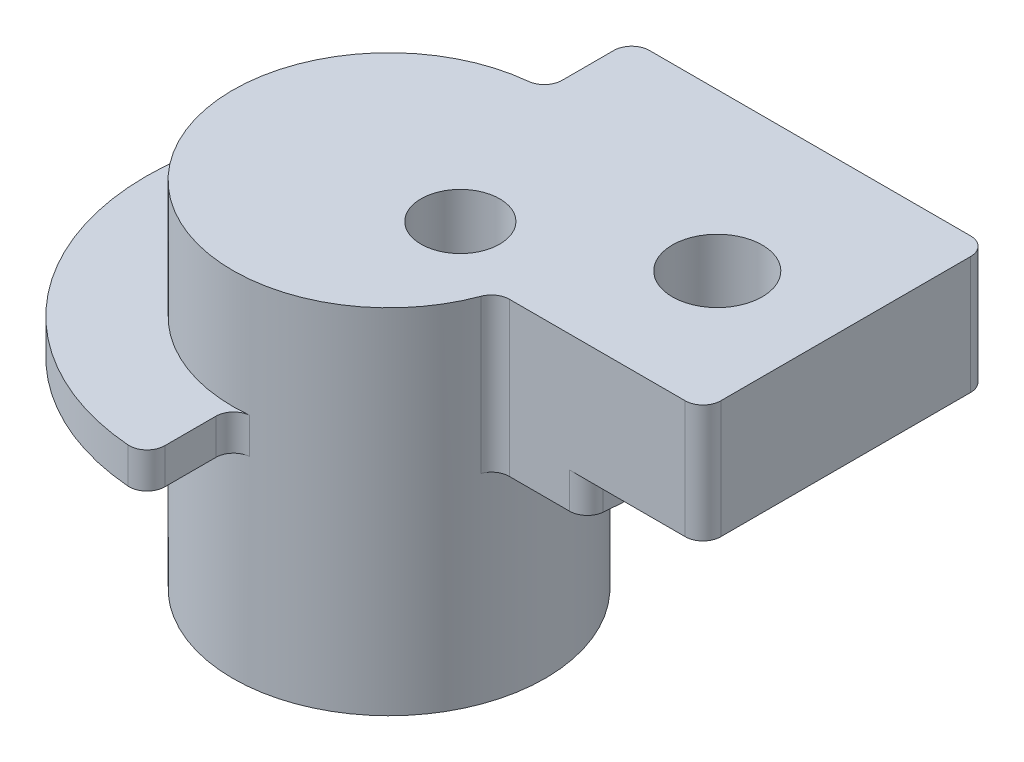
ISO-10303-21;
HEADER;
FILE_DESCRIPTION(('STEP AP214'),'2;1');
FILE_NAME('part.step','',(''),(''),'','','');
FILE_SCHEMA(('AUTOMOTIVE_DESIGN { 1 0 10303 214 1 1 1 1 }'));
ENDSEC;
DATA;
#1=APPLICATION_CONTEXT('core data for automotive mechanical design processes');
#2=APPLICATION_PROTOCOL_DEFINITION('international standard','automotive_design',2000,#1);
#3=PRODUCT_CONTEXT('',#1,'mechanical');
#4=PRODUCT('Part','Part','',(#3));
#5=PRODUCT_RELATED_PRODUCT_CATEGORY('part','',(#4));
#6=PRODUCT_DEFINITION_FORMATION('','',#4);
#7=PRODUCT_DEFINITION_CONTEXT('part definition',#1,'design');
#8=PRODUCT_DEFINITION('design','',#6,#7);
#9=PRODUCT_DEFINITION_SHAPE('','',#8);
#10=(LENGTH_UNIT() NAMED_UNIT(*) SI_UNIT(.MILLI.,.METRE.));
#11=(NAMED_UNIT(*) PLANE_ANGLE_UNIT() SI_UNIT($,.RADIAN.));
#12=(NAMED_UNIT(*) SI_UNIT($,.STERADIAN.) SOLID_ANGLE_UNIT());
#13=UNCERTAINTY_MEASURE_WITH_UNIT(LENGTH_MEASURE(1.E-05),#10,'distance_accuracy_value','');
#14=(GEOMETRIC_REPRESENTATION_CONTEXT(3) GLOBAL_UNCERTAINTY_ASSIGNED_CONTEXT((#13)) GLOBAL_UNIT_ASSIGNED_CONTEXT((#10,
#11,#12)) REPRESENTATION_CONTEXT('',''));
#15=CARTESIAN_POINT('',(0.,0.,0.));
#16=DIRECTION('',(0.,0.,1.));
#17=DIRECTION('',(1.,0.,0.));
#18=AXIS2_PLACEMENT_3D('',#15,#16,#17);
#19=CARTESIAN_POINT('',(0.,10.4775,0.));
#20=DIRECTION('',(0.,1.,0.));
#21=DIRECTION('',(-1.,0.,0.));
#22=AXIS2_PLACEMENT_3D('',#19,#20,#21);
#23=PLANE('',#22);
#24=CARTESIAN_POINT('',(0.,10.4775,0.));
#25=DIRECTION('',(0.,-1.,0.));
#26=DIRECTION('',(1.,0.,0.));
#27=AXIS2_PLACEMENT_3D('',#24,#25,#26);
#28=CIRCLE('',#27,10.795);
#29=CARTESIAN_POINT('',(9.42358156769194,10.4775,-5.26575117500406));
#30=VERTEX_POINT('',#29);
#31=CARTESIAN_POINT('',(10.641167311775,10.4775,-1.81592490010193));
#32=VERTEX_POINT('',#31);
#33=EDGE_CURVE('E259',#30,#32,#28,.T.);
#34=ORIENTED_EDGE('',*,*,#33,.F.);
#35=CARTESIAN_POINT('',(10.795,10.4775,-3.81));
#36=DIRECTION('',(0.,1.,0.));
#37=DIRECTION('',(-1.,0.,0.));
#38=AXIS2_PLACEMENT_3D('',#35,#36,#37);
#39=CIRCLE('',#38,2.);
#40=EDGE_CURVE('E218',#32,#30,#39,.F.);
#41=ORIENTED_EDGE('',*,*,#40,.F.);
#42=EDGE_LOOP('',(#34,#41));
#43=FACE_BOUND('',#42,.T.);
#44=ADVANCED_FACE('F47',(#43),#23,.T.);
#45=CARTESIAN_POINT('',(0.,15.71625,0.));
#46=DIRECTION('',(0.,-1.,0.));
#47=DIRECTION('',(1.,0.,0.));
#48=AXIS2_PLACEMENT_3D('',#45,#46,#47);
#49=PLANE('',#48);
#50=CARTESIAN_POINT('',(3.175,15.71625,0.));
#51=DIRECTION('',(0.,1.,0.));
#52=DIRECTION('',(-1.,0.,0.));
#53=AXIS2_PLACEMENT_3D('',#50,#51,#52);
#54=CIRCLE('',#53,1.75);
#55=CARTESIAN_POINT('',(1.425,15.71625,0.));
#56=VERTEX_POINT('',#55);
#57=EDGE_CURVE('E223',#56,#56,#54,.T.);
#58=ORIENTED_EDGE('',*,*,#57,.F.);
#59=EDGE_LOOP('',(#58));
#60=FACE_BOUND('',#59,.T.);
#61=DIRECTION('',(1.,0.,0.));
#62=VECTOR('',#61,1.);
#63=CARTESIAN_POINT('',(0.,15.71625,-10.795));
#64=LINE('',#63,#62);
#65=CARTESIAN_POINT('',(0.793749999999998,15.71625,-10.795));
#66=VERTEX_POINT('',#65);
#67=CARTESIAN_POINT('',(15.08125,15.71625,-10.795));
#68=VERTEX_POINT('',#67);
#69=EDGE_CURVE('E231',#66,#68,#64,.T.);
#70=ORIENTED_EDGE('',*,*,#69,.F.);
#71=CARTESIAN_POINT('',(0.793749999999998,15.71625,-10.00125));
#72=DIRECTION('',(0.,-1.,0.));
#73=DIRECTION('',(1.,0.,0.));
#74=AXIS2_PLACEMENT_3D('',#71,#72,#73);
#75=CIRCLE('',#74,0.79375);
#76=CARTESIAN_POINT('',(0.,15.71625,-10.00125));
#77=VERTEX_POINT('',#76);
#78=EDGE_CURVE('E285',#66,#77,#75,.F.);
#79=ORIENTED_EDGE('',*,*,#78,.T.);
#80=DIRECTION('',(0.,0.,1.));
#81=VECTOR('',#80,1.);
#82=CARTESIAN_POINT('',(0.,15.71625,0.));
#83=LINE('',#82,#81);
#84=CARTESIAN_POINT('',(0.,15.71625,-7.70296209259788));
#85=VERTEX_POINT('',#84);
#86=EDGE_CURVE('E235',#77,#85,#83,.T.);
#87=ORIENTED_EDGE('',*,*,#86,.T.);
#88=CARTESIAN_POINT('',(-0.793750000000003,15.71625,-7.70296209259788));
#89=DIRECTION('',(0.,-1.,0.));
#90=DIRECTION('',(1.,0.,0.));
#91=AXIS2_PLACEMENT_3D('',#88,#89,#90);
#92=CIRCLE('',#91,0.79375);
#93=CARTESIAN_POINT('',(-0.712389023405975,15.71625,-6.91339293540666));
#94=VERTEX_POINT('',#93);
#95=EDGE_CURVE('E324',#85,#94,#92,.T.);
#96=ORIENTED_EDGE('',*,*,#95,.T.);
#97=CARTESIAN_POINT('',(0.,15.71625,0.));
#98=DIRECTION('',(0.,-1.,0.));
#99=DIRECTION('',(1.,0.,0.));
#100=AXIS2_PLACEMENT_3D('',#97,#98,#99);
#101=CIRCLE('',#100,6.95);
#102=CARTESIAN_POINT('',(6.5142782965623,15.71625,2.4221226795803));
#103=VERTEX_POINT('',#102);
#104=EDGE_CURVE('E262',#103,#94,#101,.T.);
#105=ORIENTED_EDGE('',*,*,#104,.F.);
#106=CARTESIAN_POINT('',(7.2582651164035,15.71625,2.69875));
#107=DIRECTION('',(0.,-1.,0.));
#108=DIRECTION('',(1.,0.,0.));
#109=AXIS2_PLACEMENT_3D('',#106,#107,#108);
#110=CIRCLE('',#109,0.79375);
#111=CARTESIAN_POINT('',(7.2582651164035,15.71625,1.905));
#112=VERTEX_POINT('',#111);
#113=EDGE_CURVE('E327',#103,#112,#110,.T.);
#114=ORIENTED_EDGE('',*,*,#113,.T.);
#115=DIRECTION('',(1.,0.,0.));
#116=VECTOR('',#115,1.);
#117=CARTESIAN_POINT('',(0.,15.71625,1.905));
#118=LINE('',#117,#116);
#119=CARTESIAN_POINT('',(15.08125,15.71625,1.905));
#120=VERTEX_POINT('',#119);
#121=EDGE_CURVE('E188',#112,#120,#118,.T.);
#122=ORIENTED_EDGE('',*,*,#121,.T.);
#123=CARTESIAN_POINT('',(15.08125,15.71625,1.11125));
#124=DIRECTION('',(0.,-1.,0.));
#125=DIRECTION('',(1.,0.,0.));
#126=AXIS2_PLACEMENT_3D('',#123,#124,#125);
#127=CIRCLE('',#126,0.79375);
#128=CARTESIAN_POINT('',(15.875,15.71625,1.11125));
#129=VERTEX_POINT('',#128);
#130=EDGE_CURVE('E279',#120,#129,#127,.F.);
#131=ORIENTED_EDGE('',*,*,#130,.T.);
#132=DIRECTION('',(0.,0.,1.));
#133=VECTOR('',#132,1.);
#134=CARTESIAN_POINT('',(15.875,15.71625,0.));
#135=LINE('',#134,#133);
#136=CARTESIAN_POINT('',(15.875,15.71625,-10.00125));
#137=VERTEX_POINT('',#136);
#138=EDGE_CURVE('E227',#137,#129,#135,.T.);
#139=ORIENTED_EDGE('',*,*,#138,.F.);
#140=CARTESIAN_POINT('',(15.08125,15.71625,-10.00125));
#141=DIRECTION('',(0.,-1.,0.));
#142=DIRECTION('',(1.,0.,0.));
#143=AXIS2_PLACEMENT_3D('',#140,#141,#142);
#144=CIRCLE('',#143,0.79375);
#145=EDGE_CURVE('E282',#137,#68,#144,.F.);
#146=ORIENTED_EDGE('',*,*,#145,.T.);
#147=EDGE_LOOP('',(#70,#79,#87,#96,#105,#114,#122,#131,#139,#146));
#148=FACE_BOUND('',#147,.T.);
#149=CARTESIAN_POINT('',(10.795,15.71625,-3.81));
#150=DIRECTION('',(0.,1.,0.));
#151=DIRECTION('',(-1.,0.,0.));
#152=AXIS2_PLACEMENT_3D('',#149,#150,#151);
#153=CIRCLE('',#152,2.);
#154=CARTESIAN_POINT('',(8.795,15.71625,-3.81));
#155=VERTEX_POINT('',#154);
#156=EDGE_CURVE('E202',#155,#155,#153,.T.);
#157=ORIENTED_EDGE('',*,*,#156,.F.);
#158=EDGE_LOOP('',(#157));
#159=FACE_BOUND('',#158,.T.);
#160=ADVANCED_FACE('F377',(#60,#148,#159),#49,.F.);
#161=CARTESIAN_POINT('',(-0.856746031746001,10.4775,10.7609484357601));
#162=VERTEX_POINT('',#161);
#163=CARTESIAN_POINT('',(0.625135553208775,10.4775,-10.7768840830787));
#164=VERTEX_POINT('',#163);
#165=EDGE_CURVE('E255',#162,#164,#28,.T.);
#166=ORIENTED_EDGE('',*,*,#165,.F.);
#167=CARTESIAN_POINT('',(-0.793749999999972,10.4775,9.96970222724831));
#168=DIRECTION('',(0.,1.,0.));
#169=DIRECTION('',(-1.,0.,0.));
#170=AXIS2_PLACEMENT_3D('',#167,#168,#169);
#171=CIRCLE('',#170,0.79375);
#172=CARTESIAN_POINT('',(0.,10.4775,9.96970222724831));
#173=VERTEX_POINT('',#172);
#174=EDGE_CURVE('E355',#162,#173,#171,.T.);
#175=ORIENTED_EDGE('',*,*,#174,.T.);
#176=DIRECTION('',(0.,0.,1.));
#177=VECTOR('',#176,1.);
#178=CARTESIAN_POINT('',(0.,10.4775,0.));
#179=LINE('',#178,#177);
#180=CARTESIAN_POINT('',(0.,10.4775,7.70296209259789));
#181=VERTEX_POINT('',#180);
#182=EDGE_CURVE('E180',#181,#173,#179,.T.);
#183=ORIENTED_EDGE('',*,*,#182,.F.);
#184=CARTESIAN_POINT('',(0.793750000000006,10.4775,7.70296209259788));
#185=DIRECTION('',(0.,1.,0.));
#186=DIRECTION('',(-1.,0.,0.));
#187=AXIS2_PLACEMENT_3D('',#184,#185,#186);
#188=CIRCLE('',#187,0.79375);
#189=CARTESIAN_POINT('',(0.712389023405977,10.4775,6.91339293540666));
#190=VERTEX_POINT('',#189);
#191=EDGE_CURVE('E56',#181,#190,#188,.F.);
#192=ORIENTED_EDGE('',*,*,#191,.T.);
#193=CARTESIAN_POINT('',(0.,10.4775,0.));
#194=DIRECTION('',(0.,-1.,0.));
#195=DIRECTION('',(1.,0.,0.));
#196=AXIS2_PLACEMENT_3D('',#193,#194,#195);
#197=CIRCLE('',#196,6.95);
#198=CARTESIAN_POINT('',(-0.712389023405975,10.4775,-6.91339293540666));
#199=VERTEX_POINT('',#198);
#200=EDGE_CURVE('E63',#190,#199,#197,.T.);
#201=ORIENTED_EDGE('',*,*,#200,.T.);
#202=CARTESIAN_POINT('',(-0.793750000000002,10.4775,-7.70296209259788));
#203=DIRECTION('',(0.,1.,0.));
#204=DIRECTION('',(-1.,0.,0.));
#205=AXIS2_PLACEMENT_3D('',#202,#203,#204);
#206=CIRCLE('',#205,0.79375);
#207=CARTESIAN_POINT('',(0.,10.4775,-7.70296209259788));
#208=VERTEX_POINT('',#207);
#209=EDGE_CURVE('E309',#199,#208,#206,.T.);
#210=ORIENTED_EDGE('',*,*,#209,.T.);
#211=DIRECTION('',(0.,0.,-1.));
#212=VECTOR('',#211,1.);
#213=CARTESIAN_POINT('',(0.,10.4775,0.));
#214=LINE('',#213,#212);
#215=CARTESIAN_POINT('',(0.,10.4775,-10.00125));
#216=VERTEX_POINT('',#215);
#217=EDGE_CURVE('E206',#208,#216,#214,.T.);
#218=ORIENTED_EDGE('',*,*,#217,.T.);
#219=CARTESIAN_POINT('',(0.793749999999999,10.4775,-10.00125));
#220=DIRECTION('',(0.,1.,0.));
#221=DIRECTION('',(-1.,0.,0.));
#222=AXIS2_PLACEMENT_3D('',#219,#220,#221);
#223=CIRCLE('',#222,0.79375);
#224=EDGE_CURVE('E191',#216,#164,#223,.F.);
#225=ORIENTED_EDGE('',*,*,#224,.T.);
#226=EDGE_LOOP('',(#166,#175,#183,#192,#201,#210,#218,#225));
#227=FACE_BOUND('',#226,.T.);
#228=ADVANCED_FACE('F365',(#227),#23,.T.);
#229=CARTESIAN_POINT('',(0.,-15.71625,0.));
#230=DIRECTION('',(0.,-1.,0.));
#231=DIRECTION('',(1.,0.,0.));
#232=AXIS2_PLACEMENT_3D('',#229,#230,#231);
#233=CYLINDRICAL_SURFACE('',#232,10.795);
#234=CARTESIAN_POINT('',(10.728157252049,10.4775,1.19944444444444));
#235=VERTEX_POINT('',#234);
#236=EDGE_CURVE('E254',#32,#235,#28,.T.);
#237=ORIENTED_EDGE('',*,*,#236,.T.);
#238=DIRECTION('',(0.,-1.,0.));
#239=VECTOR('',#238,1.);
#240=CARTESIAN_POINT('',(10.728157252049,-15.71625,1.19944444444444));
#241=LINE('',#240,#239);
#242=CARTESIAN_POINT('',(10.728157252049,8.89,1.19944444444444));
#243=VERTEX_POINT('',#242);
#244=EDGE_CURVE('E337',#235,#243,#241,.T.);
#245=ORIENTED_EDGE('',*,*,#244,.T.);
#246=CARTESIAN_POINT('',(0.,8.89,0.));
#247=DIRECTION('',(0.,-1.,0.));
#248=DIRECTION('',(1.,0.,0.));
#249=AXIS2_PLACEMENT_3D('',#246,#247,#248);
#250=CIRCLE('',#249,10.795);
#251=CARTESIAN_POINT('',(-0.856746031746001,8.89,10.7609484357601));
#252=VERTEX_POINT('',#251);
#253=EDGE_CURVE('E250',#252,#243,#250,.T.);
#254=ORIENTED_EDGE('',*,*,#253,.F.);
#255=DIRECTION('',(0.,-1.,0.));
#256=VECTOR('',#255,1.);
#257=CARTESIAN_POINT('',(-0.856746031745998,-15.71625,10.7609484357601));
#258=LINE('',#257,#256);
#259=EDGE_CURVE('E333',#252,#162,#258,.F.);
#260=ORIENTED_EDGE('',*,*,#259,.T.);
#261=ORIENTED_EDGE('',*,*,#165,.T.);
#262=EDGE_CURVE('E258',#164,#30,#28,.T.);
#263=ORIENTED_EDGE('',*,*,#262,.T.);
#264=ORIENTED_EDGE('',*,*,#33,.T.);
#265=EDGE_LOOP('',(#237,#245,#254,#260,#261,#263,#264));
#266=FACE_BOUND('',#265,.T.);
#267=ADVANCED_FACE('F422',(#266),#233,.T.);
#268=CARTESIAN_POINT('',(0.,8.89,0.));
#269=DIRECTION('',(0.,1.,0.));
#270=DIRECTION('',(-1.,0.,0.));
#271=AXIS2_PLACEMENT_3D('',#268,#269,#270);
#272=PLANE('',#271);
#273=ORIENTED_EDGE('',*,*,#253,.T.);
#274=CARTESIAN_POINT('',(9.93932215998656,8.89,1.11125));
#275=DIRECTION('',(0.,1.,0.));
#276=DIRECTION('',(-1.,0.,0.));
#277=AXIS2_PLACEMENT_3D('',#274,#275,#276);
#278=CIRCLE('',#277,0.79375);
#279=CARTESIAN_POINT('',(9.93932215998656,8.89000000000001,1.905));
#280=VERTEX_POINT('',#279);
#281=EDGE_CURVE('E175',#243,#280,#278,.F.);
#282=ORIENTED_EDGE('',*,*,#281,.T.);
#283=DIRECTION('',(-1.,0.,0.));
#284=VECTOR('',#283,1.);
#285=CARTESIAN_POINT('',(0.,8.89,1.905));
#286=LINE('',#285,#284);
#287=CARTESIAN_POINT('',(7.2582651164035,8.89000000000001,1.905));
#288=VERTEX_POINT('',#287);
#289=EDGE_CURVE('E168',#280,#288,#286,.T.);
#290=ORIENTED_EDGE('',*,*,#289,.T.);
#291=CARTESIAN_POINT('',(7.2582651164035,8.89000000000001,2.69875));
#292=DIRECTION('',(0.,1.,0.));
#293=DIRECTION('',(-1.,0.,0.));
#294=AXIS2_PLACEMENT_3D('',#291,#292,#293);
#295=CIRCLE('',#294,0.79375);
#296=CARTESIAN_POINT('',(6.5142782965623,8.89,2.4221226795803));
#297=VERTEX_POINT('',#296);
#298=EDGE_CURVE('E173',#288,#297,#295,.T.);
#299=ORIENTED_EDGE('',*,*,#298,.T.);
#300=CARTESIAN_POINT('',(0.,8.89,0.));
#301=DIRECTION('',(0.,-1.,0.));
#302=DIRECTION('',(1.,0.,0.));
#303=AXIS2_PLACEMENT_3D('',#300,#301,#302);
#304=CIRCLE('',#303,6.95);
#305=CARTESIAN_POINT('',(0.712389023405977,8.89,6.91339293540666));
#306=VERTEX_POINT('',#305);
#307=EDGE_CURVE('E70',#306,#297,#304,.T.);
#308=ORIENTED_EDGE('',*,*,#307,.F.);
#309=CARTESIAN_POINT('',(0.793750000000006,8.89,7.70296209259788));
#310=DIRECTION('',(0.,1.,0.));
#311=DIRECTION('',(-1.,0.,0.));
#312=AXIS2_PLACEMENT_3D('',#309,#310,#311);
#313=CIRCLE('',#312,0.79375);
#314=CARTESIAN_POINT('',(0.,8.89,7.70296209259789));
#315=VERTEX_POINT('',#314);
#316=EDGE_CURVE('E11',#306,#315,#313,.T.);
#317=ORIENTED_EDGE('',*,*,#316,.T.);
#318=DIRECTION('',(0.,0.,1.));
#319=VECTOR('',#318,1.);
#320=CARTESIAN_POINT('',(0.,8.89,0.));
#321=LINE('',#320,#319);
#322=CARTESIAN_POINT('',(0.,8.89,9.96970222724831));
#323=VERTEX_POINT('',#322);
#324=EDGE_CURVE('E198',#315,#323,#321,.T.);
#325=ORIENTED_EDGE('',*,*,#324,.T.);
#326=CARTESIAN_POINT('',(-0.793749999999972,8.89,9.96970222724831));
#327=DIRECTION('',(0.,1.,0.));
#328=DIRECTION('',(-1.,0.,0.));
#329=AXIS2_PLACEMENT_3D('',#326,#327,#328);
#330=CIRCLE('',#329,0.79375);
#331=EDGE_CURVE('E340',#323,#252,#330,.F.);
#332=ORIENTED_EDGE('',*,*,#331,.T.);
#333=EDGE_LOOP('',(#273,#282,#290,#299,#308,#317,#325,#332));
#334=FACE_BOUND('',#333,.T.);
#335=ADVANCED_FACE('F171',(#334),#272,.F.);
#336=CARTESIAN_POINT('',(0.,-15.71625,0.));
#337=DIRECTION('',(0.,-1.,0.));
#338=DIRECTION('',(1.,0.,0.));
#339=AXIS2_PLACEMENT_3D('',#336,#337,#338);
#340=CYLINDRICAL_SURFACE('',#339,6.95);
#341=ORIENTED_EDGE('',*,*,#200,.F.);
#342=DIRECTION('',(0.,-1.,0.));
#343=VECTOR('',#342,1.);
#344=CARTESIAN_POINT('',(0.71238902340598,-15.71625,6.91339293540666));
#345=LINE('',#344,#343);
#346=EDGE_CURVE('E352',#190,#306,#345,.T.);
#347=ORIENTED_EDGE('',*,*,#346,.T.);
#348=ORIENTED_EDGE('',*,*,#307,.T.);
#349=DIRECTION('',(0.,-1.,0.));
#350=VECTOR('',#349,1.);
#351=CARTESIAN_POINT('',(6.51427829656231,-15.71625,2.4221226795803));
#352=LINE('',#351,#350);
#353=EDGE_CURVE('E196',#297,#103,#352,.F.);
#354=ORIENTED_EDGE('',*,*,#353,.T.);
#355=ORIENTED_EDGE('',*,*,#104,.T.);
#356=DIRECTION('',(0.,-1.,0.));
#357=VECTOR('',#356,1.);
#358=CARTESIAN_POINT('',(-0.712389023405972,-15.71625,-6.91339293540666));
#359=LINE('',#358,#357);
#360=EDGE_CURVE('E306',#94,#199,#359,.T.);
#361=ORIENTED_EDGE('',*,*,#360,.T.);
#362=EDGE_LOOP('',(#341,#347,#348,#354,#355,#361));
#363=FACE_BOUND('',#362,.T.);
#364=CARTESIAN_POINT('',(0.,0.,0.));
#365=DIRECTION('',(0.,1.,0.));
#366=DIRECTION('',(0.,0.,1.));
#367=AXIS2_PLACEMENT_3D('',#364,#365,#366);
#368=CIRCLE('',#367,6.95);
#369=CARTESIAN_POINT('',(0.,0.,6.95));
#370=VERTEX_POINT('',#369);
#371=EDGE_CURVE('E251',#370,#370,#368,.T.);
#372=ORIENTED_EDGE('',*,*,#371,.T.);
#373=EDGE_LOOP('',(#372));
#374=FACE_BOUND('',#373,.T.);
#375=ADVANCED_FACE('F371',(#363,#374),#340,.T.);
#376=CARTESIAN_POINT('',(0.,0.,0.));
#377=DIRECTION('',(0.,1.,0.));
#378=DIRECTION('',(0.,0.,1.));
#379=AXIS2_PLACEMENT_3D('',#376,#377,#378);
#380=PLANE('',#379);
#381=CARTESIAN_POINT('',(3.175,0.,0.));
#382=DIRECTION('',(0.,1.,0.));
#383=DIRECTION('',(0.,0.,1.));
#384=AXIS2_PLACEMENT_3D('',#381,#382,#383);
#385=CIRCLE('',#384,1.75);
#386=CARTESIAN_POINT('',(3.175,0.,1.75));
#387=VERTEX_POINT('',#386);
#388=EDGE_CURVE('E247',#387,#387,#385,.T.);
#389=ORIENTED_EDGE('',*,*,#388,.T.);
#390=EDGE_LOOP('',(#389));
#391=FACE_BOUND('',#390,.T.);
#392=ORIENTED_EDGE('',*,*,#371,.F.);
#393=EDGE_LOOP('',(#392));
#394=FACE_BOUND('',#393,.T.);
#395=ADVANCED_FACE('F457',(#391,#394),#380,.F.);
#396=CARTESIAN_POINT('',(3.175,-11.71575,0.));
#397=DIRECTION('',(0.,1.,0.));
#398=DIRECTION('',(-1.,0.,0.));
#399=AXIS2_PLACEMENT_3D('',#396,#397,#398);
#400=CYLINDRICAL_SURFACE('',#399,1.75);
#401=ORIENTED_EDGE('',*,*,#57,.T.);
#402=EDGE_LOOP('',(#401));
#403=FACE_BOUND('',#402,.T.);
#404=ORIENTED_EDGE('',*,*,#388,.F.);
#405=EDGE_LOOP('',(#404));
#406=FACE_BOUND('',#405,.T.);
#407=ADVANCED_FACE('F460',(#403,#406),#400,.F.);
#408=CARTESIAN_POINT('',(10.795,-9.85241945384929,-3.81));
#409=DIRECTION('',(0.,1.,0.));
#410=DIRECTION('',(-1.,0.,0.));
#411=AXIS2_PLACEMENT_3D('',#408,#409,#410);
#412=CYLINDRICAL_SURFACE('',#411,2.);
#413=EDGE_CURVE('E219',#30,#32,#39,.F.);
#414=ORIENTED_EDGE('',*,*,#413,.T.);
#415=ORIENTED_EDGE('',*,*,#40,.T.);
#416=EDGE_LOOP('',(#414,#415));
#417=FACE_BOUND('',#416,.T.);
#418=ORIENTED_EDGE('',*,*,#156,.T.);
#419=EDGE_LOOP('',(#418));
#420=FACE_BOUND('',#419,.T.);
#421=ADVANCED_FACE('F431',(#417,#420),#412,.F.);
#422=CARTESIAN_POINT('',(0.,-9.85241945384929,-10.795));
#423=DIRECTION('',(0.,0.,1.));
#424=DIRECTION('',(1.,0.,0.));
#425=AXIS2_PLACEMENT_3D('',#422,#423,#424);
#426=PLANE('',#425);
#427=DIRECTION('',(-1.,0.,0.));
#428=VECTOR('',#427,1.);
#429=CARTESIAN_POINT('',(0.,10.4775,-10.795));
#430=LINE('',#429,#428);
#431=CARTESIAN_POINT('',(15.08125,10.4775,-10.795));
#432=VERTEX_POINT('',#431);
#433=CARTESIAN_POINT('',(0.793749999999998,10.4775,-10.795));
#434=VERTEX_POINT('',#433);
#435=EDGE_CURVE('E211',#432,#434,#430,.T.);
#436=ORIENTED_EDGE('',*,*,#435,.T.);
#437=DIRECTION('',(0.,1.,0.));
#438=VECTOR('',#437,1.);
#439=CARTESIAN_POINT('',(0.793749999999998,15.71625,-10.795));
#440=LINE('',#439,#438);
#441=EDGE_CURVE('E275',#434,#66,#440,.T.);
#442=ORIENTED_EDGE('',*,*,#441,.T.);
#443=ORIENTED_EDGE('',*,*,#69,.T.);
#444=DIRECTION('',(0.,1.,0.));
#445=VECTOR('',#444,1.);
#446=CARTESIAN_POINT('',(15.08125,-9.85241945384929,-10.795));
#447=LINE('',#446,#445);
#448=EDGE_CURVE('E266',#68,#432,#447,.F.);
#449=ORIENTED_EDGE('',*,*,#448,.T.);
#450=EDGE_LOOP('',(#436,#442,#443,#449));
#451=FACE_BOUND('',#450,.T.);
#452=ADVANCED_FACE('F400',(#451),#426,.F.);
#453=CARTESIAN_POINT('',(0.,-9.85241945384929,0.));
#454=DIRECTION('',(-1.,0.,0.));
#455=DIRECTION('',(0.,-1.,0.));
#456=AXIS2_PLACEMENT_3D('',#453,#454,#455);
#457=PLANE('',#456);
#458=ORIENTED_EDGE('',*,*,#86,.F.);
#459=DIRECTION('',(0.,1.,0.));
#460=VECTOR('',#459,1.);
#461=CARTESIAN_POINT('',(0.,10.4775,-10.00125));
#462=LINE('',#461,#460);
#463=EDGE_CURVE('E292',#77,#216,#462,.F.);
#464=ORIENTED_EDGE('',*,*,#463,.T.);
#465=ORIENTED_EDGE('',*,*,#217,.F.);
#466=DIRECTION('',(0.,-1.,0.));
#467=VECTOR('',#466,1.);
#468=CARTESIAN_POINT('',(0.,-9.85241945384929,-7.70296209259788));
#469=LINE('',#468,#467);
#470=EDGE_CURVE('E288',#208,#85,#469,.F.);
#471=ORIENTED_EDGE('',*,*,#470,.T.);
#472=EDGE_LOOP('',(#458,#464,#465,#471));
#473=FACE_BOUND('',#472,.T.);
#474=ADVANCED_FACE('F386',(#473),#457,.T.);
#475=CARTESIAN_POINT('',(0.,-9.85241945384929,1.905));
#476=DIRECTION('',(0.,0.,1.));
#477=DIRECTION('',(1.,0.,0.));
#478=AXIS2_PLACEMENT_3D('',#475,#476,#477);
#479=PLANE('',#478);
#480=ORIENTED_EDGE('',*,*,#289,.F.);
#481=DIRECTION('',(0.,1.,0.));
#482=VECTOR('',#481,1.);
#483=CARTESIAN_POINT('',(9.93932215998656,10.4775,1.905));
#484=LINE('',#483,#482);
#485=CARTESIAN_POINT('',(9.93932215998656,10.4775,1.905));
#486=VERTEX_POINT('',#485);
#487=EDGE_CURVE('E330',#280,#486,#484,.T.);
#488=ORIENTED_EDGE('',*,*,#487,.T.);
#489=DIRECTION('',(-1.,0.,0.));
#490=VECTOR('',#489,1.);
#491=CARTESIAN_POINT('',(0.,10.4775,1.905));
#492=LINE('',#491,#490);
#493=CARTESIAN_POINT('',(15.08125,10.4775,1.905));
#494=VERTEX_POINT('',#493);
#495=EDGE_CURVE('E210',#494,#486,#492,.T.);
#496=ORIENTED_EDGE('',*,*,#495,.F.);
#497=DIRECTION('',(0.,1.,0.));
#498=VECTOR('',#497,1.);
#499=CARTESIAN_POINT('',(15.08125,15.71625,1.905));
#500=LINE('',#499,#498);
#501=EDGE_CURVE('E192',#494,#120,#500,.T.);
#502=ORIENTED_EDGE('',*,*,#501,.T.);
#503=ORIENTED_EDGE('',*,*,#121,.F.);
#504=DIRECTION('',(0.,-1.,0.));
#505=VECTOR('',#504,1.);
#506=CARTESIAN_POINT('',(7.2582651164035,-9.85241945384929,1.905));
#507=LINE('',#506,#505);
#508=EDGE_CURVE('E184',#112,#288,#507,.T.);
#509=ORIENTED_EDGE('',*,*,#508,.T.);
#510=EDGE_LOOP('',(#480,#488,#496,#502,#503,#509));
#511=FACE_BOUND('',#510,.T.);
#512=ADVANCED_FACE('F185',(#511),#479,.T.);
#513=CARTESIAN_POINT('',(15.875,-9.85241945384929,0.));
#514=DIRECTION('',(-1.,0.,0.));
#515=DIRECTION('',(0.,-1.,0.));
#516=AXIS2_PLACEMENT_3D('',#513,#514,#515);
#517=PLANE('',#516);
#518=DIRECTION('',(0.,0.,-1.));
#519=VECTOR('',#518,1.);
#520=CARTESIAN_POINT('',(15.875,10.4775,0.));
#521=LINE('',#520,#519);
#522=CARTESIAN_POINT('',(15.875,10.4775,1.11125));
#523=VERTEX_POINT('',#522);
#524=CARTESIAN_POINT('',(15.875,10.4775,-10.00125));
#525=VERTEX_POINT('',#524);
#526=EDGE_CURVE('E214',#523,#525,#521,.T.);
#527=ORIENTED_EDGE('',*,*,#526,.T.);
#528=DIRECTION('',(0.,1.,0.));
#529=VECTOR('',#528,1.);
#530=CARTESIAN_POINT('',(15.875,-9.85241945384929,-10.00125));
#531=LINE('',#530,#529);
#532=EDGE_CURVE('E315',#525,#137,#531,.T.);
#533=ORIENTED_EDGE('',*,*,#532,.T.);
#534=ORIENTED_EDGE('',*,*,#138,.T.);
#535=DIRECTION('',(0.,1.,0.));
#536=VECTOR('',#535,1.);
#537=CARTESIAN_POINT('',(15.875,10.4775,1.11125));
#538=LINE('',#537,#536);
#539=EDGE_CURVE('E312',#129,#523,#538,.F.);
#540=ORIENTED_EDGE('',*,*,#539,.T.);
#541=EDGE_LOOP('',(#527,#533,#534,#540));
#542=FACE_BOUND('',#541,.T.);
#543=ADVANCED_FACE('F408',(#542),#517,.F.);
#544=CARTESIAN_POINT('',(0.,10.4775,0.));
#545=DIRECTION('',(0.,1.,0.));
#546=DIRECTION('',(-1.,0.,0.));
#547=AXIS2_PLACEMENT_3D('',#544,#545,#546);
#548=PLANE('',#547);
#549=ORIENTED_EDGE('',*,*,#262,.F.);
#550=CARTESIAN_POINT('',(0.793749999999999,10.4775,-10.00125));
#551=DIRECTION('',(0.,1.,0.));
#552=DIRECTION('',(-1.,0.,0.));
#553=AXIS2_PLACEMENT_3D('',#550,#551,#552);
#554=CIRCLE('',#553,0.79375);
#555=EDGE_CURVE('E301',#164,#434,#554,.F.);
#556=ORIENTED_EDGE('',*,*,#555,.T.);
#557=ORIENTED_EDGE('',*,*,#435,.F.);
#558=CARTESIAN_POINT('',(15.08125,10.4775,-10.00125));
#559=DIRECTION('',(0.,1.,0.));
#560=DIRECTION('',(-1.,0.,0.));
#561=AXIS2_PLACEMENT_3D('',#558,#559,#560);
#562=CIRCLE('',#561,0.79375);
#563=EDGE_CURVE('E298',#432,#525,#562,.F.);
#564=ORIENTED_EDGE('',*,*,#563,.T.);
#565=ORIENTED_EDGE('',*,*,#526,.F.);
#566=CARTESIAN_POINT('',(15.08125,10.4775,1.11125));
#567=DIRECTION('',(0.,1.,0.));
#568=DIRECTION('',(-1.,0.,0.));
#569=AXIS2_PLACEMENT_3D('',#566,#567,#568);
#570=CIRCLE('',#569,0.79375);
#571=EDGE_CURVE('E295',#523,#494,#570,.F.);
#572=ORIENTED_EDGE('',*,*,#571,.T.);
#573=ORIENTED_EDGE('',*,*,#495,.T.);
#574=CARTESIAN_POINT('',(9.93932215998656,10.4775,1.11125));
#575=DIRECTION('',(0.,1.,0.));
#576=DIRECTION('',(-1.,0.,0.));
#577=AXIS2_PLACEMENT_3D('',#574,#575,#576);
#578=CIRCLE('',#577,0.79375);
#579=EDGE_CURVE('E358',#486,#235,#578,.T.);
#580=ORIENTED_EDGE('',*,*,#579,.T.);
#581=ORIENTED_EDGE('',*,*,#236,.F.);
#582=ORIENTED_EDGE('',*,*,#413,.F.);
#583=EDGE_LOOP('',(#549,#556,#557,#564,#565,#572,#573,#580,#581,#582));
#584=FACE_BOUND('',#583,.T.);
#585=ADVANCED_FACE('F396',(#584),#548,.F.);
#586=CARTESIAN_POINT('',(0.793750000000001,-9.85241945384929,-10.00125));
#587=DIRECTION('',(0.,-1.,0.));
#588=DIRECTION('',(1.,0.,0.));
#589=AXIS2_PLACEMENT_3D('',#586,#587,#588);
#590=CYLINDRICAL_SURFACE('',#589,0.79375);
#591=ORIENTED_EDGE('',*,*,#224,.F.);
#592=ORIENTED_EDGE('',*,*,#463,.F.);
#593=ORIENTED_EDGE('',*,*,#78,.F.);
#594=ORIENTED_EDGE('',*,*,#441,.F.);
#595=ORIENTED_EDGE('',*,*,#555,.F.);
#596=EDGE_LOOP('',(#591,#592,#593,#594,#595));
#597=FACE_BOUND('',#596,.T.);
#598=ADVANCED_FACE('F391',(#597),#590,.T.);
#599=CARTESIAN_POINT('',(-0.793749999999999,-15.71625,-7.70296209259788));
#600=DIRECTION('',(0.,-1.,0.));
#601=DIRECTION('',(1.,0.,0.));
#602=AXIS2_PLACEMENT_3D('',#599,#600,#601);
#603=CYLINDRICAL_SURFACE('',#602,0.79375);
#604=ORIENTED_EDGE('',*,*,#209,.F.);
#605=ORIENTED_EDGE('',*,*,#360,.F.);
#606=ORIENTED_EDGE('',*,*,#95,.F.);
#607=ORIENTED_EDGE('',*,*,#470,.F.);
#608=EDGE_LOOP('',(#604,#605,#606,#607));
#609=FACE_BOUND('',#608,.T.);
#610=ADVANCED_FACE('F383',(#609),#603,.F.);
#611=CARTESIAN_POINT('',(15.08125,-9.85241945384929,-10.00125));
#612=DIRECTION('',(0.,1.,0.));
#613=DIRECTION('',(-1.,0.,0.));
#614=AXIS2_PLACEMENT_3D('',#611,#612,#613);
#615=CYLINDRICAL_SURFACE('',#614,0.79375);
#616=ORIENTED_EDGE('',*,*,#563,.F.);
#617=ORIENTED_EDGE('',*,*,#448,.F.);
#618=ORIENTED_EDGE('',*,*,#145,.F.);
#619=ORIENTED_EDGE('',*,*,#532,.F.);
#620=EDGE_LOOP('',(#616,#617,#618,#619));
#621=FACE_BOUND('',#620,.T.);
#622=ADVANCED_FACE('F403',(#621),#615,.T.);
#623=CARTESIAN_POINT('',(7.2582651164035,-15.71625,2.69875));
#624=DIRECTION('',(0.,-1.,0.));
#625=DIRECTION('',(1.,0.,0.));
#626=AXIS2_PLACEMENT_3D('',#623,#624,#625);
#627=CYLINDRICAL_SURFACE('',#626,0.79375);
#628=ORIENTED_EDGE('',*,*,#353,.F.);
#629=ORIENTED_EDGE('',*,*,#298,.F.);
#630=ORIENTED_EDGE('',*,*,#508,.F.);
#631=ORIENTED_EDGE('',*,*,#113,.F.);
#632=EDGE_LOOP('',(#628,#629,#630,#631));
#633=FACE_BOUND('',#632,.T.);
#634=ADVANCED_FACE('F194',(#633),#627,.F.);
#635=CARTESIAN_POINT('',(15.08125,-9.85241945384929,1.11125));
#636=DIRECTION('',(0.,-1.,0.));
#637=DIRECTION('',(1.,0.,0.));
#638=AXIS2_PLACEMENT_3D('',#635,#636,#637);
#639=CYLINDRICAL_SURFACE('',#638,0.79375);
#640=ORIENTED_EDGE('',*,*,#571,.F.);
#641=ORIENTED_EDGE('',*,*,#539,.F.);
#642=ORIENTED_EDGE('',*,*,#130,.F.);
#643=ORIENTED_EDGE('',*,*,#501,.F.);
#644=EDGE_LOOP('',(#640,#641,#642,#643));
#645=FACE_BOUND('',#644,.T.);
#646=ADVANCED_FACE('F412',(#645),#639,.T.);
#647=CARTESIAN_POINT('',(0.,-3.7465,0.));
#648=DIRECTION('',(-1.,0.,0.));
#649=DIRECTION('',(0.,0.,1.));
#650=AXIS2_PLACEMENT_3D('',#647,#648,#649);
#651=PLANE('',#650);
#652=ORIENTED_EDGE('',*,*,#324,.F.);
#653=DIRECTION('',(0.,1.,0.));
#654=VECTOR('',#653,1.);
#655=CARTESIAN_POINT('',(0.,10.4775,7.70296209259789));
#656=LINE('',#655,#654);
#657=EDGE_CURVE('E348',#315,#181,#656,.T.);
#658=ORIENTED_EDGE('',*,*,#657,.T.);
#659=ORIENTED_EDGE('',*,*,#182,.T.);
#660=DIRECTION('',(0.,-1.,0.));
#661=VECTOR('',#660,1.);
#662=CARTESIAN_POINT('',(0.,-3.7465,9.96970222724831));
#663=LINE('',#662,#661);
#664=EDGE_CURVE('E345',#173,#323,#663,.T.);
#665=ORIENTED_EDGE('',*,*,#664,.T.);
#666=EDGE_LOOP('',(#652,#658,#659,#665));
#667=FACE_BOUND('',#666,.T.);
#668=ADVANCED_FACE('F475',(#667),#651,.F.);
#669=CARTESIAN_POINT('',(9.93932215998656,-15.71625,1.11125));
#670=DIRECTION('',(0.,-1.,0.));
#671=DIRECTION('',(1.,0.,0.));
#672=AXIS2_PLACEMENT_3D('',#669,#670,#671);
#673=CYLINDRICAL_SURFACE('',#672,0.79375);
#674=ORIENTED_EDGE('',*,*,#281,.F.);
#675=ORIENTED_EDGE('',*,*,#244,.F.);
#676=ORIENTED_EDGE('',*,*,#579,.F.);
#677=ORIENTED_EDGE('',*,*,#487,.F.);
#678=EDGE_LOOP('',(#674,#675,#676,#677));
#679=FACE_BOUND('',#678,.T.);
#680=ADVANCED_FACE('F417',(#679),#673,.T.);
#681=CARTESIAN_POINT('',(0.793750000000009,-15.71625,7.70296209259788));
#682=DIRECTION('',(0.,-1.,0.));
#683=DIRECTION('',(1.,0.,0.));
#684=AXIS2_PLACEMENT_3D('',#681,#682,#683);
#685=CYLINDRICAL_SURFACE('',#684,0.79375);
#686=ORIENTED_EDGE('',*,*,#316,.F.);
#687=ORIENTED_EDGE('',*,*,#346,.F.);
#688=ORIENTED_EDGE('',*,*,#191,.F.);
#689=ORIENTED_EDGE('',*,*,#657,.F.);
#690=EDGE_LOOP('',(#686,#687,#688,#689));
#691=FACE_BOUND('',#690,.T.);
#692=ADVANCED_FACE('F370',(#691),#685,.F.);
#693=CARTESIAN_POINT('',(-0.793749999999969,-15.71625,9.96970222724831));
#694=DIRECTION('',(0.,-1.,0.));
#695=DIRECTION('',(1.,0.,0.));
#696=AXIS2_PLACEMENT_3D('',#693,#694,#695);
#697=CYLINDRICAL_SURFACE('',#696,0.79375);
#698=ORIENTED_EDGE('',*,*,#331,.F.);
#699=ORIENTED_EDGE('',*,*,#664,.F.);
#700=ORIENTED_EDGE('',*,*,#174,.F.);
#701=ORIENTED_EDGE('',*,*,#259,.F.);
#702=EDGE_LOOP('',(#698,#699,#700,#701));
#703=FACE_BOUND('',#702,.T.);
#704=ADVANCED_FACE('F49',(#703),#697,.T.);
#705=CLOSED_SHELL('',(#44,#160,#228,#267,#335,#375,#395,#407,#421,#452,#474,#512,#543,#585,#598,
#610,#622,#634,#646,#668,#680,#692,#704));
#706=MANIFOLD_SOLID_BREP('B2',#705);
#707=ADVANCED_BREP_SHAPE_REPRESENTATION('',(#18,#706),#14);
#708=SHAPE_DEFINITION_REPRESENTATION(#9,#707);
ENDSEC;
END-ISO-10303-21;
